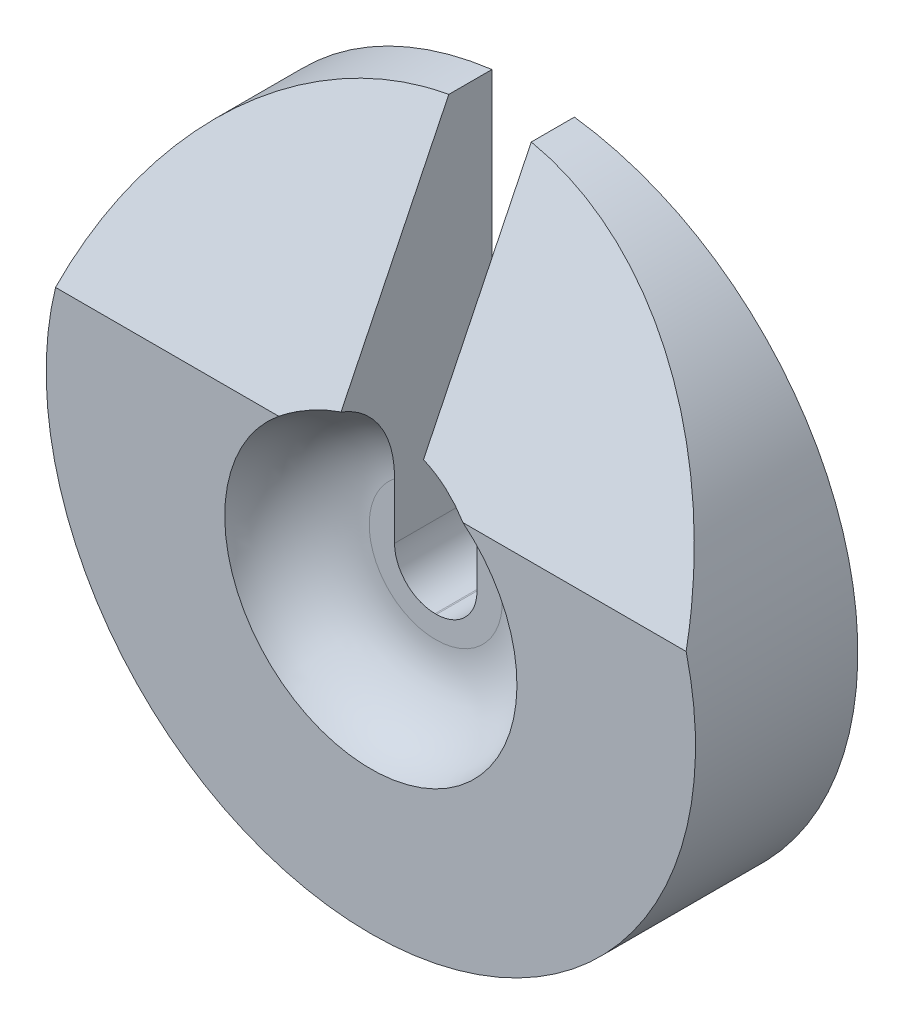
ISO-10303-21;
HEADER;
FILE_DESCRIPTION(('STEP AP214'),'2;1');
FILE_NAME('part.step','',(''),(''),'','','');
FILE_SCHEMA(('AUTOMOTIVE_DESIGN { 1 0 10303 214 1 1 1 1 }'));
ENDSEC;
DATA;
#1=APPLICATION_CONTEXT('core data for automotive mechanical design processes');
#2=APPLICATION_PROTOCOL_DEFINITION('international standard','automotive_design',2000,#1);
#3=PRODUCT_CONTEXT('',#1,'mechanical');
#4=PRODUCT('Part','Part','',(#3));
#5=PRODUCT_RELATED_PRODUCT_CATEGORY('part','',(#4));
#6=PRODUCT_DEFINITION_FORMATION('','',#4);
#7=PRODUCT_DEFINITION_CONTEXT('part definition',#1,'design');
#8=PRODUCT_DEFINITION('design','',#6,#7);
#9=PRODUCT_DEFINITION_SHAPE('','',#8);
#10=(LENGTH_UNIT() NAMED_UNIT(*) SI_UNIT(.MILLI.,.METRE.));
#11=(NAMED_UNIT(*) PLANE_ANGLE_UNIT() SI_UNIT($,.RADIAN.));
#12=(NAMED_UNIT(*) SI_UNIT($,.STERADIAN.) SOLID_ANGLE_UNIT());
#13=UNCERTAINTY_MEASURE_WITH_UNIT(LENGTH_MEASURE(1.E-05),#10,'distance_accuracy_value','');
#14=(GEOMETRIC_REPRESENTATION_CONTEXT(3) GLOBAL_UNCERTAINTY_ASSIGNED_CONTEXT((#13)) GLOBAL_UNIT_ASSIGNED_CONTEXT((#10,
#11,#12)) REPRESENTATION_CONTEXT('',''));
#15=CARTESIAN_POINT('',(0.,0.,0.));
#16=DIRECTION('',(0.,0.,1.));
#17=DIRECTION('',(1.,0.,0.));
#18=AXIS2_PLACEMENT_3D('',#15,#16,#17);
#19=CARTESIAN_POINT('',(-0.00797057818488467,-0.488169113110181,2.));
#20=DIRECTION('',(0.,0.,-1.));
#21=DIRECTION('',(-1.,0.,0.));
#22=AXIS2_PLACEMENT_3D('',#19,#20,#21);
#23=CYLINDRICAL_SURFACE('',#22,0.5);
#24=DIRECTION('',(0.,0.,-1.));
#25=VECTOR('',#24,1.);
#26=CARTESIAN_POINT('',(-0.507970578184885,-0.488169113110181,2.));
#27=LINE('',#26,#25);
#28=CARTESIAN_POINT('',(-0.507970578184885,-0.488169113110181,1.2));
#29=VERTEX_POINT('',#28);
#30=CARTESIAN_POINT('',(-0.507970578184885,-0.488169113110181,0.));
#31=VERTEX_POINT('',#30);
#32=EDGE_CURVE('E172',#29,#31,#27,.T.);
#33=ORIENTED_EDGE('',*,*,#32,.F.);
#34=CARTESIAN_POINT('',(-0.00797057818488467,-0.488169113110181,1.2));
#35=DIRECTION('',(0.,0.,1.));
#36=DIRECTION('',(1.,0.,0.));
#37=AXIS2_PLACEMENT_3D('',#34,#35,#36);
#38=CIRCLE('',#37,0.5);
#39=CARTESIAN_POINT('',(-0.00797057818488467,-0.988169113110182,1.2));
#40=VERTEX_POINT('',#39);
#41=EDGE_CURVE('E216',#29,#40,#38,.T.);
#42=ORIENTED_EDGE('',*,*,#41,.T.);
#43=DIRECTION('',(0.,0.,-1.));
#44=VECTOR('',#43,1.);
#45=CARTESIAN_POINT('',(-0.00797057818488467,-0.988169113110182,2.));
#46=LINE('',#45,#44);
#47=CARTESIAN_POINT('',(-0.00797057818488467,-0.988169113110182,0.));
#48=VERTEX_POINT('',#47);
#49=EDGE_CURVE('E139',#40,#48,#46,.T.);
#50=ORIENTED_EDGE('',*,*,#49,.T.);
#51=CARTESIAN_POINT('',(-0.00797057818488467,-0.488169113110181,0.));
#52=DIRECTION('',(0.,0.,1.));
#53=DIRECTION('',(1.,0.,0.));
#54=AXIS2_PLACEMENT_3D('',#51,#52,#53);
#55=CIRCLE('',#54,0.5);
#56=EDGE_CURVE('E151',#31,#48,#55,.T.);
#57=ORIENTED_EDGE('',*,*,#56,.F.);
#58=EDGE_LOOP('',(#33,#42,#50,#57));
#59=FACE_BOUND('',#58,.T.);
#60=ADVANCED_FACE('F37',(#59),#23,.F.);
#61=CARTESIAN_POINT('',(0.00797057818488467,-0.488169113110181,2.));
#62=DIRECTION('',(0.,0.,-1.));
#63=DIRECTION('',(-1.,0.,0.));
#64=AXIS2_PLACEMENT_3D('',#61,#62,#63);
#65=CYLINDRICAL_SURFACE('',#64,0.5);
#66=CARTESIAN_POINT('',(0.00797057818488467,-0.488169113110181,1.2));
#67=DIRECTION('',(0.,0.,1.));
#68=DIRECTION('',(1.,0.,0.));
#69=AXIS2_PLACEMENT_3D('',#66,#67,#68);
#70=CIRCLE('',#69,0.5);
#71=CARTESIAN_POINT('',(0.507970578184885,-0.488169113110181,1.2));
#72=VERTEX_POINT('',#71);
#73=CARTESIAN_POINT('',(0.00797057818488467,-0.988169113110182,1.2));
#74=VERTEX_POINT('',#73);
#75=EDGE_CURVE('E123',#72,#74,#70,.F.);
#76=ORIENTED_EDGE('',*,*,#75,.F.);
#77=DIRECTION('',(0.,0.,-1.));
#78=VECTOR('',#77,1.);
#79=CARTESIAN_POINT('',(0.507970578184885,-0.488169113110181,2.));
#80=LINE('',#79,#78);
#81=CARTESIAN_POINT('',(0.507970578184885,-0.488169113110181,0.));
#82=VERTEX_POINT('',#81);
#83=EDGE_CURVE('E166',#72,#82,#80,.T.);
#84=ORIENTED_EDGE('',*,*,#83,.T.);
#85=CARTESIAN_POINT('',(0.00797057818488467,-0.488169113110181,0.));
#86=DIRECTION('',(0.,0.,1.));
#87=DIRECTION('',(1.,0.,0.));
#88=AXIS2_PLACEMENT_3D('',#85,#86,#87);
#89=CIRCLE('',#88,0.5);
#90=CARTESIAN_POINT('',(0.00797057818488467,-0.988169113110182,0.));
#91=VERTEX_POINT('',#90);
#92=EDGE_CURVE('E145',#82,#91,#89,.F.);
#93=ORIENTED_EDGE('',*,*,#92,.T.);
#94=DIRECTION('',(0.,0.,-1.));
#95=VECTOR('',#94,1.);
#96=CARTESIAN_POINT('',(0.00797057818488467,-0.988169113110182,2.));
#97=LINE('',#96,#95);
#98=EDGE_CURVE('E142',#74,#91,#97,.T.);
#99=ORIENTED_EDGE('',*,*,#98,.F.);
#100=EDGE_LOOP('',(#76,#84,#93,#99));
#101=FACE_BOUND('',#100,.T.);
#102=ADVANCED_FACE('F199',(#101),#65,.F.);
#103=CARTESIAN_POINT('',(0.,-0.988169113110182,2.));
#104=DIRECTION('',(0.,1.,0.));
#105=DIRECTION('',(0.,0.,1.));
#106=AXIS2_PLACEMENT_3D('',#103,#104,#105);
#107=PLANE('',#106);
#108=ORIENTED_EDGE('',*,*,#49,.F.);
#109=DIRECTION('',(1.,0.,0.));
#110=VECTOR('',#109,1.);
#111=CARTESIAN_POINT('',(0.,-0.988169113110182,1.2));
#112=LINE('',#111,#110);
#113=EDGE_CURVE('E175',#40,#74,#112,.T.);
#114=ORIENTED_EDGE('',*,*,#113,.T.);
#115=ORIENTED_EDGE('',*,*,#98,.T.);
#116=DIRECTION('',(1.,0.,0.));
#117=VECTOR('',#116,1.);
#118=CARTESIAN_POINT('',(0.,-0.988169113110182,0.));
#119=LINE('',#118,#117);
#120=EDGE_CURVE('E140',#48,#91,#119,.T.);
#121=ORIENTED_EDGE('',*,*,#120,.F.);
#122=EDGE_LOOP('',(#108,#114,#115,#121));
#123=FACE_BOUND('',#122,.T.);
#124=ADVANCED_FACE('F205',(#123),#107,.T.);
#125=CARTESIAN_POINT('',(-0.507970578184885,0.,2.));
#126=DIRECTION('',(-1.,0.,0.));
#127=DIRECTION('',(0.,-1.,0.));
#128=AXIS2_PLACEMENT_3D('',#125,#126,#127);
#129=PLANE('',#128);
#130=DIRECTION('',(0.,0.,-1.));
#131=VECTOR('',#130,1.);
#132=CARTESIAN_POINT('',(-0.507970578184885,3.96761463497887,2.));
#133=LINE('',#132,#131);
#134=CARTESIAN_POINT('',(-0.507970578184883,3.96761463497887,0.531409465379998));
#135=VERTEX_POINT('',#134);
#136=CARTESIAN_POINT('',(-0.507970578184885,3.96761463497887,0.));
#137=VERTEX_POINT('',#136);
#138=EDGE_CURVE('E170',#135,#137,#133,.T.);
#139=ORIENTED_EDGE('',*,*,#138,.F.);
#140=DIRECTION('',(0.,-0.898925650458152,0.438101215415328));
#141=VECTOR('',#140,1.);
#142=CARTESIAN_POINT('',(-0.507970578184885,0.183153948854256,2.37580763717286));
#143=LINE('',#142,#141);
#144=CARTESIAN_POINT('',(-0.507970578184885,1.24294837145434,1.85930527193848));
#145=VERTEX_POINT('',#144);
#146=EDGE_CURVE('E119',#135,#145,#143,.T.);
#147=ORIENTED_EDGE('',*,*,#146,.T.);
#148=CARTESIAN_POINT('',(-0.507970578184885,1.28428930304394,2.));
#149=CARTESIAN_POINT('',(-0.507970578184885,1.27857866237132,1.97316021642539));
#150=CARTESIAN_POINT('',(-0.507970578184885,1.27172212839322,1.94657823142271));
#151=CARTESIAN_POINT('',(-0.507970578184885,1.25577289576954,1.89409756172596));
#152=CARTESIAN_POINT('',(-0.507970578184885,1.2466804920979,1.86819878739589));
#153=CARTESIAN_POINT('',(-0.507970578184885,1.21618591504073,1.79190769814542));
#154=CARTESIAN_POINT('',(-0.507970578184885,1.19153448466153,1.74277191474916));
#155=CARTESIAN_POINT('',(-0.507970578184885,1.13436857558165,1.64934657561838));
#156=CARTESIAN_POINT('',(-0.507970578184885,1.10185344089696,1.60505742463403));
#157=CARTESIAN_POINT('',(-0.507970578184885,1.02996169086907,1.52244532241376));
#158=CARTESIAN_POINT('',(-0.507970578184885,0.990584295632079,1.48412305025012));
#159=CARTESIAN_POINT('',(-0.507970578184885,0.905427313342334,1.41374252087261));
#160=CARTESIAN_POINT('',(-0.507970578184885,0.859548064335783,1.38180514051744));
#161=CARTESIAN_POINT('',(-0.507970578184885,0.763304777588601,1.32564965054923));
#162=CARTESIAN_POINT('',(-0.507970578184885,0.712940445898022,1.30143204736338));
#163=CARTESIAN_POINT('',(-0.507970578184885,0.606319181611052,1.25982891430382));
#164=CARTESIAN_POINT('',(-0.507970578184885,0.549890762198373,1.24288616061715));
#165=CARTESIAN_POINT('',(-0.507970578184885,0.435167910476061,1.21753328755472));
#166=CARTESIAN_POINT('',(-0.507970578184885,0.376873152127341,1.20912466752784));
#167=CARTESIAN_POINT('',(-0.507970578184885,0.298872397562432,1.20294954354113));
#168=CARTESIAN_POINT('',(-0.507970578184885,0.279372734402808,1.20182580301273));
#169=CARTESIAN_POINT('',(-0.507970578184885,0.240391611127296,1.20035191275341));
#170=CARTESIAN_POINT('',(-0.507970578184885,0.220910223477463,1.19999987430362));
#171=CARTESIAN_POINT('',(-0.507970578184885,0.20142490466674,1.2));
#172=B_SPLINE_CURVE_WITH_KNOTS('',3,(#148,#149,#150,#151,#152,#153,#154,#155,#156,#157,#158,
#159,#160,#161,#162,#163,#164,#165,#166,#167,#168,#169,#170,#171),.UNSPECIFIED.,.F.,.F.,(4,2,2,
2,2,2,2,2,2,2,2,4),(0.,0.0822697584188855,0.164528668966066,0.3285961556982,0.49267733353409,
0.65677717132071,0.823738404650045,0.990710588594977,1.16675623018834,1.34283279561974,
1.40141983460726,1.45986332263709),.UNSPECIFIED.);
#173=CARTESIAN_POINT('',(-0.507970578184885,0.20142490466674,1.2));
#174=VERTEX_POINT('',#173);
#175=EDGE_CURVE('E188',#145,#174,#172,.T.);
#176=ORIENTED_EDGE('',*,*,#175,.T.);
#177=DIRECTION('',(0.,1.,0.));
#178=VECTOR('',#177,1.);
#179=CARTESIAN_POINT('',(-0.507970578184885,0.,1.2));
#180=LINE('',#179,#178);
#181=EDGE_CURVE('E149',#29,#174,#180,.T.);
#182=ORIENTED_EDGE('',*,*,#181,.F.);
#183=ORIENTED_EDGE('',*,*,#32,.T.);
#184=DIRECTION('',(0.,1.,0.));
#185=VECTOR('',#184,1.);
#186=CARTESIAN_POINT('',(-0.507970578184885,0.,0.));
#187=LINE('',#186,#185);
#188=EDGE_CURVE('E154',#31,#137,#187,.T.);
#189=ORIENTED_EDGE('',*,*,#188,.T.);
#190=EDGE_LOOP('',(#139,#147,#176,#182,#183,#189));
#191=FACE_BOUND('',#190,.T.);
#192=ADVANCED_FACE('F202',(#191),#129,.F.);
#193=CARTESIAN_POINT('',(0.,0.,2.));
#194=DIRECTION('',(0.,0.,-1.));
#195=DIRECTION('',(-1.,0.,0.));
#196=AXIS2_PLACEMENT_3D('',#193,#194,#195);
#197=CYLINDRICAL_SURFACE('',#196,4.);
#198=DIRECTION('',(0.,0.,-1.));
#199=VECTOR('',#198,1.);
#200=CARTESIAN_POINT('',(0.507970578184885,3.96761463497887,2.));
#201=LINE('',#200,#199);
#202=CARTESIAN_POINT('',(0.507970578184884,3.96761463497887,0.531409465379998));
#203=VERTEX_POINT('',#202);
#204=CARTESIAN_POINT('',(0.507970578184885,3.96761463497887,0.));
#205=VERTEX_POINT('',#204);
#206=EDGE_CURVE('E168',#203,#205,#201,.T.);
#207=ORIENTED_EDGE('',*,*,#206,.F.);
#208=CARTESIAN_POINT('',(0.,0.,2.46506971080517));
#209=DIRECTION('',(0.,-0.438101215415328,-0.898925650458152));
#210=DIRECTION('',(0.,0.898925650458152,-0.438101215415328));
#211=AXIS2_PLACEMENT_3D('',#208,#209,#210);
#212=ELLIPSE('',#211,4.44975621505665,4.);
#213=CARTESIAN_POINT('',(3.88450577593485,0.95426142997021,2.));
#214=VERTEX_POINT('',#213);
#215=EDGE_CURVE('E125',#203,#214,#212,.T.);
#216=ORIENTED_EDGE('',*,*,#215,.T.);
#217=CARTESIAN_POINT('',(0.,0.,2.));
#218=DIRECTION('',(0.,0.,1.));
#219=DIRECTION('',(1.,0.,0.));
#220=AXIS2_PLACEMENT_3D('',#217,#218,#219);
#221=CIRCLE('',#220,4.);
#222=CARTESIAN_POINT('',(-3.88450577593485,0.95426142997021,2.));
#223=VERTEX_POINT('',#222);
#224=EDGE_CURVE('E131',#223,#214,#221,.T.);
#225=ORIENTED_EDGE('',*,*,#224,.F.);
#226=EDGE_CURVE('E116',#223,#135,#212,.T.);
#227=ORIENTED_EDGE('',*,*,#226,.T.);
#228=ORIENTED_EDGE('',*,*,#138,.T.);
#229=CARTESIAN_POINT('',(0.,0.,0.));
#230=DIRECTION('',(0.,0.,1.));
#231=DIRECTION('',(1.,0.,0.));
#232=AXIS2_PLACEMENT_3D('',#229,#230,#231);
#233=CIRCLE('',#232,4.);
#234=EDGE_CURVE('E157',#137,#205,#233,.T.);
#235=ORIENTED_EDGE('',*,*,#234,.T.);
#236=EDGE_LOOP('',(#207,#216,#225,#227,#228,#235));
#237=FACE_BOUND('',#236,.T.);
#238=ADVANCED_FACE('F138',(#237),#197,.T.);
#239=CARTESIAN_POINT('',(0.507970578184885,0.,2.));
#240=DIRECTION('',(1.,0.,0.));
#241=DIRECTION('',(0.,1.,0.));
#242=AXIS2_PLACEMENT_3D('',#239,#240,#241);
#243=PLANE('',#242);
#244=CARTESIAN_POINT('',(0.507970578184885,0.20142490466674,1.2));
#245=CARTESIAN_POINT('',(0.507970578184885,0.23603715529549,1.19998117354456));
#246=CARTESIAN_POINT('',(0.507970578184885,0.270671924645411,1.20110861143521));
#247=CARTESIAN_POINT('',(0.507970578184885,0.339812566409272,1.20592624734888));
#248=CARTESIAN_POINT('',(0.507970578184885,0.374318160354234,1.20962036571823));
#249=CARTESIAN_POINT('',(0.507970578184885,0.44306248152054,1.21986464947431));
#250=CARTESIAN_POINT('',(0.507970578184885,0.477299491219484,1.22642668413528));
#251=CARTESIAN_POINT('',(0.507970578184885,0.545033078730611,1.24254650466753));
#252=CARTESIAN_POINT('',(0.507970578184885,0.578530107850844,1.25210240739719));
#253=CARTESIAN_POINT('',(0.507970578184885,0.667581488079054,1.28207175116404));
#254=CARTESIAN_POINT('',(0.507970578184885,0.722192563841996,1.30540612668443));
#255=CARTESIAN_POINT('',(0.507970578184885,0.826616285887807,1.36082580061411));
#256=CARTESIAN_POINT('',(0.507970578184885,0.876440011347996,1.3928902016334));
#257=CARTESIAN_POINT('',(0.507970578184885,0.969965178261294,1.46530510591931));
#258=CARTESIAN_POINT('',(0.507970578184885,1.01364451824662,1.50568429639734));
#259=CARTESIAN_POINT('',(0.507970578184885,1.09315525657653,1.59361756712131));
#260=CARTESIAN_POINT('',(0.507970578184885,1.12897992406616,1.64117774245466));
#261=CARTESIAN_POINT('',(0.507970578184885,1.18951947821425,1.73893308551573));
#262=CARTESIAN_POINT('',(0.507970578184885,1.21478045676711,1.78878841447207));
#263=CARTESIAN_POINT('',(0.507970578184885,1.24596748997733,1.86622888354409));
#264=CARTESIAN_POINT('',(0.507970578184885,1.25524994936288,1.89250481184329));
#265=CARTESIAN_POINT('',(0.507970578184885,1.27151221039979,1.94576523455161));
#266=CARTESIAN_POINT('',(0.507970578184885,1.2784915718142,1.97274986336574));
#267=CARTESIAN_POINT('',(0.507970578184885,1.28428930304394,2.));
#268=B_SPLINE_CURVE_WITH_KNOTS('',3,(#244,#245,#246,#247,#248,#249,#250,#251,#252,#253,#254,
#255,#256,#257,#258,#259,#260,#261,#262,#263,#264,#265,#266,#267),.UNSPECIFIED.,.F.,.F.,(4,2,2,
2,2,2,2,2,2,2,2,4),(0.,0.103850424152891,0.207859819090368,0.3123038092065,0.416682235549463,
0.593998680754747,0.770894353013025,0.948410885831436,1.12607894733979,1.29286440926781,
1.37637534990009,1.45990224440593),.UNSPECIFIED.);
#269=CARTESIAN_POINT('',(0.507970578184885,0.20142490466674,1.2));
#270=VERTEX_POINT('',#269);
#271=CARTESIAN_POINT('',(0.507970578184885,1.24294837145434,1.85930527193848));
#272=VERTEX_POINT('',#271);
#273=EDGE_CURVE('E181',#270,#272,#268,.T.);
#274=ORIENTED_EDGE('',*,*,#273,.T.);
#275=DIRECTION('',(0.,0.898925650458152,-0.438101215415328));
#276=VECTOR('',#275,1.);
#277=CARTESIAN_POINT('',(0.507970578184885,0.183153948854256,2.37580763717286));
#278=LINE('',#277,#276);
#279=EDGE_CURVE('E57',#272,#203,#278,.T.);
#280=ORIENTED_EDGE('',*,*,#279,.T.);
#281=ORIENTED_EDGE('',*,*,#206,.T.);
#282=DIRECTION('',(0.,-1.,0.));
#283=VECTOR('',#282,1.);
#284=CARTESIAN_POINT('',(0.507970578184885,0.,0.));
#285=LINE('',#284,#283);
#286=EDGE_CURVE('E160',#205,#82,#285,.T.);
#287=ORIENTED_EDGE('',*,*,#286,.T.);
#288=ORIENTED_EDGE('',*,*,#83,.F.);
#289=DIRECTION('',(0.,-1.,0.));
#290=VECTOR('',#289,1.);
#291=CARTESIAN_POINT('',(0.507970578184885,0.,1.2));
#292=LINE('',#291,#290);
#293=EDGE_CURVE('E257',#270,#72,#292,.T.);
#294=ORIENTED_EDGE('',*,*,#293,.F.);
#295=EDGE_LOOP('',(#274,#280,#281,#287,#288,#294));
#296=FACE_BOUND('',#295,.T.);
#297=ADVANCED_FACE('F193',(#296),#243,.F.);
#298=CARTESIAN_POINT('',(0.,0.,2.));
#299=DIRECTION('',(0.,0.,1.));
#300=DIRECTION('',(1.,0.,0.));
#301=AXIS2_PLACEMENT_3D('',#298,#299,#300);
#302=PLANE('',#301);
#303=DIRECTION('',(1.,0.,0.));
#304=VECTOR('',#303,1.);
#305=CARTESIAN_POINT('',(-6.3,0.95426142997021,2.));
#306=LINE('',#305,#304);
#307=CARTESIAN_POINT('',(-1.13530805088846,0.954261429970209,2.));
#308=VERTEX_POINT('',#307);
#309=EDGE_CURVE('E65',#223,#308,#306,.T.);
#310=ORIENTED_EDGE('',*,*,#309,.F.);
#311=ORIENTED_EDGE('',*,*,#224,.T.);
#312=CARTESIAN_POINT('',(1.13530805088846,0.954261429970209,2.));
#313=VERTEX_POINT('',#312);
#314=EDGE_CURVE('E134',#313,#214,#306,.T.);
#315=ORIENTED_EDGE('',*,*,#314,.F.);
#316=CARTESIAN_POINT('',(0.,-0.442547658483847,2.));
#317=DIRECTION('',(0.,0.,1.));
#318=DIRECTION('',(1.,0.,0.));
#319=AXIS2_PLACEMENT_3D('',#316,#317,#318);
#320=CIRCLE('',#319,1.8);
#321=EDGE_CURVE('E133',#308,#313,#320,.T.);
#322=ORIENTED_EDGE('',*,*,#321,.F.);
#323=EDGE_LOOP('',(#310,#311,#315,#322));
#324=FACE_BOUND('',#323,.T.);
#325=ADVANCED_FACE('F129',(#324),#302,.T.);
#326=CARTESIAN_POINT('',(0.,0.,0.));
#327=DIRECTION('',(0.,0.,1.));
#328=DIRECTION('',(1.,0.,0.));
#329=AXIS2_PLACEMENT_3D('',#326,#327,#328);
#330=PLANE('',#329);
#331=ORIENTED_EDGE('',*,*,#56,.T.);
#332=ORIENTED_EDGE('',*,*,#120,.T.);
#333=ORIENTED_EDGE('',*,*,#92,.F.);
#334=ORIENTED_EDGE('',*,*,#286,.F.);
#335=ORIENTED_EDGE('',*,*,#234,.F.);
#336=ORIENTED_EDGE('',*,*,#188,.F.);
#337=EDGE_LOOP('',(#331,#332,#333,#334,#335,#336));
#338=FACE_BOUND('',#337,.T.);
#339=ADVANCED_FACE('F223',(#338),#330,.F.);
#340=CARTESIAN_POINT('',(0.,-0.442547658483847,1.2));
#341=DIRECTION('',(0.,0.,1.));
#342=DIRECTION('',(1.,0.,0.));
#343=AXIS2_PLACEMENT_3D('',#340,#341,#342);
#344=PLANE('',#343);
#345=ORIENTED_EDGE('',*,*,#181,.T.);
#346=CARTESIAN_POINT('',(0.,-0.442547658483847,1.2));
#347=DIRECTION('',(0.,0.,1.));
#348=DIRECTION('',(1.,0.,0.));
#349=AXIS2_PLACEMENT_3D('',#346,#347,#348);
#350=CIRCLE('',#349,0.820204102886729);
#351=EDGE_CURVE('E178',#174,#270,#350,.T.);
#352=ORIENTED_EDGE('',*,*,#351,.T.);
#353=ORIENTED_EDGE('',*,*,#293,.T.);
#354=ORIENTED_EDGE('',*,*,#75,.T.);
#355=ORIENTED_EDGE('',*,*,#113,.F.);
#356=ORIENTED_EDGE('',*,*,#41,.F.);
#357=EDGE_LOOP('',(#345,#352,#353,#354,#355,#356));
#358=FACE_BOUND('',#357,.T.);
#359=ADVANCED_FACE('F238',(#358),#344,.T.);
#360=CARTESIAN_POINT('',(0.,-0.442547658483847,2.2));
#361=DIRECTION('',(0.,0.,-1.));
#362=DIRECTION('',(-1.,0.,0.));
#363=AXIS2_PLACEMENT_3D('',#360,#361,#362);
#364=DEGENERATE_TOROIDAL_SURFACE('',#363,0.820204102886729,1.,.T.);
#365=ORIENTED_EDGE('',*,*,#175,.F.);
#366=CARTESIAN_POINT('',(-0.299377561469101,1.28448930304078,1.83905984607014));
#367=CARTESIAN_POINT('',(-0.383416191467703,1.27228818421084,1.84500619434277));
#368=CARTESIAN_POINT('',(-0.466558126092606,1.25485662697582,1.85350165379189));
#369=CARTESIAN_POINT('',(-0.62789450945154,1.2102118835195,1.87525975621132));
#370=CARTESIAN_POINT('',(-0.706150765938366,1.18317878000495,1.88843463391131));
#371=CARTESIAN_POINT('',(-0.844454912085766,1.1251049707938,1.91673753792371));
#372=CARTESIAN_POINT('',(-0.905296802425236,1.09558740117901,1.93112324726214));
#373=CARTESIAN_POINT('',(-1.02356008906783,1.02982091748762,1.9631752600444));
#374=CARTESIAN_POINT('',(-1.08091657876117,0.993477775273213,1.98088748659843));
#375=CARTESIAN_POINT('',(-1.13558560372785,0.95406142997021,2.00009747218031));
#376=B_SPLINE_CURVE_WITH_KNOTS('',3,(#366,#367,#368,#369,#370,#371,#372,#373,#374,#375),
.UNSPECIFIED.,.F.,.F.,(4,2,2,2,4),(0.,0.255256439050084,0.505958352922794,0.712900759295304,
0.922943741676105),.UNSPECIFIED.);
#377=EDGE_CURVE('E11',#145,#308,#376,.T.);
#378=ORIENTED_EDGE('',*,*,#377,.T.);
#379=ORIENTED_EDGE('',*,*,#321,.T.);
#380=CARTESIAN_POINT('',(1.13558560372785,0.95406142997021,2.00009747218031));
#381=CARTESIAN_POINT('',(1.0690521411111,1.00205718957457,1.97670621550993));
#382=CARTESIAN_POINT('',(0.998509072497244,1.04548001882622,1.95554362629888));
#383=CARTESIAN_POINT('',(0.85248104933662,1.12201729492639,1.91824235041808));
#384=CARTESIAN_POINT('',(0.777106124437211,1.15530113553694,1.90202110785176));
#385=CARTESIAN_POINT('',(0.635742225378966,1.207098748332,1.87677697658288));
#386=CARTESIAN_POINT('',(0.570456320177504,1.22718458330705,1.86698792594147));
#387=CARTESIAN_POINT('',(0.436804387897691,1.26091066438234,1.85055115266356));
#388=CARTESIAN_POINT('',(0.368406998588318,1.27445064406656,1.84395229595796));
#389=CARTESIAN_POINT('',(0.299377561447378,1.28448930304394,1.8390598460686));
#390=B_SPLINE_CURVE_WITH_KNOTS('',3,(#380,#381,#382,#383,#384,#385,#386,#387,#388,#389),
.UNSPECIFIED.,.F.,.F.,(4,2,2,2,4),(0.,0.255611330915845,0.506682619246494,0.713271338030347,
0.92293142069797),.UNSPECIFIED.);
#391=EDGE_CURVE('E50',#313,#272,#390,.T.);
#392=ORIENTED_EDGE('',*,*,#391,.T.);
#393=ORIENTED_EDGE('',*,*,#273,.F.);
#394=ORIENTED_EDGE('',*,*,#351,.F.);
#395=EDGE_LOOP('',(#365,#378,#379,#392,#393,#394));
#396=FACE_BOUND('',#395,.T.);
#397=ADVANCED_FACE('F39',(#396),#364,.F.);
#398=CARTESIAN_POINT('',(-6.3,0.970794788921718,1.99194228727608));
#399=DIRECTION('',(0.,-0.438101215415328,-0.898925650458152));
#400=DIRECTION('',(0.,0.898925650458152,-0.438101215415328));
#401=AXIS2_PLACEMENT_3D('',#398,#399,#400);
#402=PLANE('',#401);
#403=ORIENTED_EDGE('',*,*,#279,.F.);
#404=ORIENTED_EDGE('',*,*,#391,.F.);
#405=ORIENTED_EDGE('',*,*,#314,.T.);
#406=ORIENTED_EDGE('',*,*,#215,.F.);
#407=EDGE_LOOP('',(#403,#404,#405,#406));
#408=FACE_BOUND('',#407,.T.);
#409=ADVANCED_FACE('F237',(#408),#402,.F.);
#410=ORIENTED_EDGE('',*,*,#309,.T.);
#411=ORIENTED_EDGE('',*,*,#377,.F.);
#412=ORIENTED_EDGE('',*,*,#146,.F.);
#413=ORIENTED_EDGE('',*,*,#226,.F.);
#414=EDGE_LOOP('',(#410,#411,#412,#413));
#415=FACE_BOUND('',#414,.T.);
#416=ADVANCED_FACE('F117',(#415),#402,.F.);
#417=CLOSED_SHELL('',(#60,#102,#124,#192,#238,#297,#325,#339,#359,#397,#409,#416));
#418=MANIFOLD_SOLID_BREP('B2',#417);
#419=ADVANCED_BREP_SHAPE_REPRESENTATION('',(#18,#418),#14);
#420=SHAPE_DEFINITION_REPRESENTATION(#9,#419);
ENDSEC;
END-ISO-10303-21;
